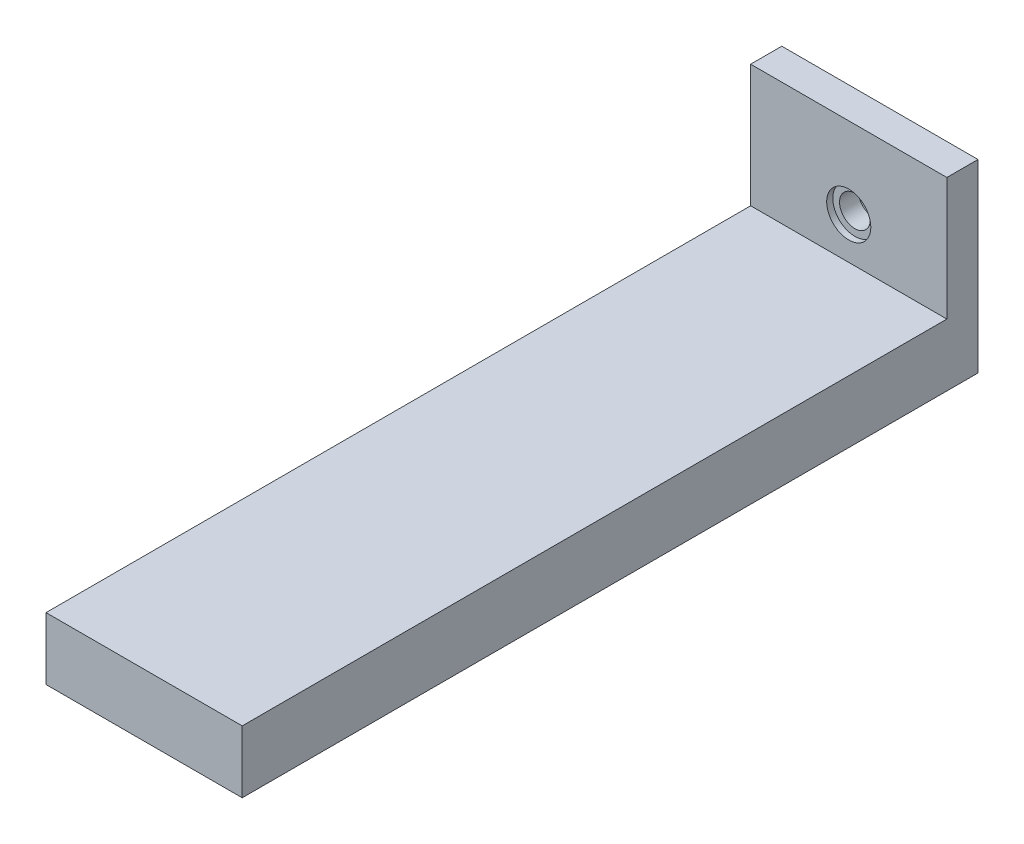
ISO-10303-21;
HEADER;
FILE_DESCRIPTION(('STEP AP214'),'2;1');
FILE_NAME('part.step','',(''),(''),'','','');
FILE_SCHEMA(('AUTOMOTIVE_DESIGN { 1 0 10303 214 1 1 1 1 }'));
ENDSEC;
DATA;
#1=APPLICATION_CONTEXT('core data for automotive mechanical design processes');
#2=APPLICATION_PROTOCOL_DEFINITION('international standard','automotive_design',2000,#1);
#3=PRODUCT_CONTEXT('',#1,'mechanical');
#4=PRODUCT('Part','Part','',(#3));
#5=PRODUCT_RELATED_PRODUCT_CATEGORY('part','',(#4));
#6=PRODUCT_DEFINITION_FORMATION('','',#4);
#7=PRODUCT_DEFINITION_CONTEXT('part definition',#1,'design');
#8=PRODUCT_DEFINITION('design','',#6,#7);
#9=PRODUCT_DEFINITION_SHAPE('','',#8);
#10=(LENGTH_UNIT() NAMED_UNIT(*) SI_UNIT(.MILLI.,.METRE.));
#11=(NAMED_UNIT(*) PLANE_ANGLE_UNIT() SI_UNIT($,.RADIAN.));
#12=(NAMED_UNIT(*) SI_UNIT($,.STERADIAN.) SOLID_ANGLE_UNIT());
#13=UNCERTAINTY_MEASURE_WITH_UNIT(LENGTH_MEASURE(1.E-05),#10,'distance_accuracy_value','');
#14=(GEOMETRIC_REPRESENTATION_CONTEXT(3) GLOBAL_UNCERTAINTY_ASSIGNED_CONTEXT((#13)) GLOBAL_UNIT_ASSIGNED_CONTEXT((#10,
#11,#12)) REPRESENTATION_CONTEXT('',''));
#15=CARTESIAN_POINT('',(0.,0.,0.));
#16=DIRECTION('',(0.,0.,1.));
#17=DIRECTION('',(1.,0.,0.));
#18=AXIS2_PLACEMENT_3D('',#15,#16,#17);
#19=CARTESIAN_POINT('',(0.,59.2348592439388,-374.6));
#20=DIRECTION('',(0.,0.,1.));
#21=DIRECTION('',(1.,0.,0.));
#22=AXIS2_PLACEMENT_3D('',#19,#20,#21);
#23=CYLINDRICAL_SURFACE('',#22,12.5);
#24=CARTESIAN_POINT('',(0.,59.2348592439388,-279.6));
#25=DIRECTION('',(0.,0.,1.));
#26=DIRECTION('',(1.,0.,0.));
#27=AXIS2_PLACEMENT_3D('',#24,#25,#26);
#28=CIRCLE('',#27,12.5);
#29=CARTESIAN_POINT('',(12.5,59.2348592439388,-279.6));
#30=VERTEX_POINT('',#29);
#31=EDGE_CURVE('E138',#30,#30,#28,.F.);
#32=ORIENTED_EDGE('',*,*,#31,.F.);
#33=EDGE_LOOP('',(#32));
#34=FACE_BOUND('',#33,.T.);
#35=CARTESIAN_POINT('',(0.,59.2348592439388,-295.));
#36=DIRECTION('',(0.,0.,-1.));
#37=DIRECTION('',(-1.,0.,0.));
#38=AXIS2_PLACEMENT_3D('',#35,#36,#37);
#39=CIRCLE('',#38,12.5);
#40=CARTESIAN_POINT('',(-12.5,59.2348592439388,-295.));
#41=VERTEX_POINT('',#40);
#42=EDGE_CURVE('E40',#41,#41,#39,.F.);
#43=ORIENTED_EDGE('',*,*,#42,.F.);
#44=EDGE_LOOP('',(#43));
#45=FACE_BOUND('',#44,.T.);
#46=ADVANCED_FACE('F36',(#34,#45),#23,.F.);
#47=CARTESIAN_POINT('',(80.,25.4,300.));
#48=DIRECTION('',(0.,-1.,0.));
#49=DIRECTION('',(1.,0.,0.));
#50=AXIS2_PLACEMENT_3D('',#47,#48,#49);
#51=PLANE('',#50);
#52=DIRECTION('',(1.,0.,0.));
#53=VECTOR('',#52,1.);
#54=CARTESIAN_POINT('',(-80.,25.4,-274.6));
#55=LINE('',#54,#53);
#56=CARTESIAN_POINT('',(-80.,25.4,-274.6));
#57=VERTEX_POINT('',#56);
#58=CARTESIAN_POINT('',(80.,25.4,-274.6));
#59=VERTEX_POINT('',#58);
#60=EDGE_CURVE('E53',#57,#59,#55,.T.);
#61=ORIENTED_EDGE('',*,*,#60,.F.);
#62=DIRECTION('',(0.,0.,-1.));
#63=VECTOR('',#62,1.);
#64=CARTESIAN_POINT('',(-80.,25.4,300.));
#65=LINE('',#64,#63);
#66=CARTESIAN_POINT('',(-80.,25.4,300.));
#67=VERTEX_POINT('',#66);
#68=EDGE_CURVE('E119',#67,#57,#65,.T.);
#69=ORIENTED_EDGE('',*,*,#68,.F.);
#70=DIRECTION('',(-1.,0.,0.));
#71=VECTOR('',#70,1.);
#72=CARTESIAN_POINT('',(80.,25.4,300.));
#73=LINE('',#72,#71);
#74=CARTESIAN_POINT('',(80.,25.4,300.));
#75=VERTEX_POINT('',#74);
#76=EDGE_CURVE('E62',#75,#67,#73,.T.);
#77=ORIENTED_EDGE('',*,*,#76,.F.);
#78=DIRECTION('',(0.,0.,-1.));
#79=VECTOR('',#78,1.);
#80=CARTESIAN_POINT('',(80.,25.4,300.));
#81=LINE('',#80,#79);
#82=EDGE_CURVE('E136',#75,#59,#81,.T.);
#83=ORIENTED_EDGE('',*,*,#82,.T.);
#84=EDGE_LOOP('',(#61,#69,#77,#83));
#85=FACE_BOUND('',#84,.T.);
#86=ADVANCED_FACE('F169',(#85),#51,.F.);
#87=CARTESIAN_POINT('',(-80.,-25.4,300.));
#88=DIRECTION('',(1.,0.,0.));
#89=DIRECTION('',(0.,0.,-1.));
#90=AXIS2_PLACEMENT_3D('',#87,#88,#89);
#91=PLANE('',#90);
#92=DIRECTION('',(0.,-1.,0.));
#93=VECTOR('',#92,1.);
#94=CARTESIAN_POINT('',(-80.,-25.4,-300.));
#95=LINE('',#94,#93);
#96=CARTESIAN_POINT('',(-80.,125.4,-300.));
#97=VERTEX_POINT('',#96);
#98=CARTESIAN_POINT('',(-80.,-25.4,-300.));
#99=VERTEX_POINT('',#98);
#100=EDGE_CURVE('E120',#97,#99,#95,.T.);
#101=ORIENTED_EDGE('',*,*,#100,.T.);
#102=DIRECTION('',(0.,0.,-1.));
#103=VECTOR('',#102,1.);
#104=CARTESIAN_POINT('',(-80.,-25.4,300.));
#105=LINE('',#104,#103);
#106=CARTESIAN_POINT('',(-80.,-25.4,300.));
#107=VERTEX_POINT('',#106);
#108=EDGE_CURVE('E11',#107,#99,#105,.T.);
#109=ORIENTED_EDGE('',*,*,#108,.F.);
#110=DIRECTION('',(0.,-1.,0.));
#111=VECTOR('',#110,1.);
#112=CARTESIAN_POINT('',(-80.,-25.4,300.));
#113=LINE('',#112,#111);
#114=EDGE_CURVE('E126',#67,#107,#113,.T.);
#115=ORIENTED_EDGE('',*,*,#114,.F.);
#116=ORIENTED_EDGE('',*,*,#68,.T.);
#117=DIRECTION('',(0.,-1.,0.));
#118=VECTOR('',#117,1.);
#119=CARTESIAN_POINT('',(-80.,125.4,-274.6));
#120=LINE('',#119,#118);
#121=CARTESIAN_POINT('',(-80.,125.4,-274.6));
#122=VERTEX_POINT('',#121);
#123=EDGE_CURVE('E101',#122,#57,#120,.T.);
#124=ORIENTED_EDGE('',*,*,#123,.F.);
#125=DIRECTION('',(0.,0.,1.));
#126=VECTOR('',#125,1.);
#127=CARTESIAN_POINT('',(-80.,125.4,-300.));
#128=LINE('',#127,#126);
#129=EDGE_CURVE('E108',#97,#122,#128,.T.);
#130=ORIENTED_EDGE('',*,*,#129,.F.);
#131=EDGE_LOOP('',(#101,#109,#115,#116,#124,#130));
#132=FACE_BOUND('',#131,.T.);
#133=ADVANCED_FACE('F38',(#132),#91,.F.);
#134=CARTESIAN_POINT('',(80.,-25.4,300.));
#135=DIRECTION('',(0.,1.,0.));
#136=DIRECTION('',(-1.,0.,0.));
#137=AXIS2_PLACEMENT_3D('',#134,#135,#136);
#138=PLANE('',#137);
#139=DIRECTION('',(1.,0.,0.));
#140=VECTOR('',#139,1.);
#141=CARTESIAN_POINT('',(80.,-25.4,-300.));
#142=LINE('',#141,#140);
#143=CARTESIAN_POINT('',(80.,-25.4,-300.));
#144=VERTEX_POINT('',#143);
#145=EDGE_CURVE('E75',#99,#144,#142,.T.);
#146=ORIENTED_EDGE('',*,*,#145,.T.);
#147=DIRECTION('',(0.,0.,-1.));
#148=VECTOR('',#147,1.);
#149=CARTESIAN_POINT('',(80.,-25.4,300.));
#150=LINE('',#149,#148);
#151=CARTESIAN_POINT('',(80.,-25.4,300.));
#152=VERTEX_POINT('',#151);
#153=EDGE_CURVE('E45',#152,#144,#150,.T.);
#154=ORIENTED_EDGE('',*,*,#153,.F.);
#155=DIRECTION('',(1.,0.,0.));
#156=VECTOR('',#155,1.);
#157=CARTESIAN_POINT('',(80.,-25.4,300.));
#158=LINE('',#157,#156);
#159=EDGE_CURVE('E80',#107,#152,#158,.T.);
#160=ORIENTED_EDGE('',*,*,#159,.F.);
#161=ORIENTED_EDGE('',*,*,#108,.T.);
#162=EDGE_LOOP('',(#146,#154,#160,#161));
#163=FACE_BOUND('',#162,.T.);
#164=ADVANCED_FACE('F160',(#163),#138,.F.);
#165=CARTESIAN_POINT('',(80.,-25.4,300.));
#166=DIRECTION('',(-1.,0.,0.));
#167=DIRECTION('',(0.,0.,1.));
#168=AXIS2_PLACEMENT_3D('',#165,#166,#167);
#169=PLANE('',#168);
#170=DIRECTION('',(0.,1.,0.));
#171=VECTOR('',#170,1.);
#172=CARTESIAN_POINT('',(80.,-25.4,-300.));
#173=LINE('',#172,#171);
#174=CARTESIAN_POINT('',(80.,125.4,-300.));
#175=VERTEX_POINT('',#174);
#176=EDGE_CURVE('E128',#144,#175,#173,.T.);
#177=ORIENTED_EDGE('',*,*,#176,.T.);
#178=DIRECTION('',(0.,0.,-1.));
#179=VECTOR('',#178,1.);
#180=CARTESIAN_POINT('',(80.,125.4,-300.));
#181=LINE('',#180,#179);
#182=CARTESIAN_POINT('',(80.,125.4,-274.6));
#183=VERTEX_POINT('',#182);
#184=EDGE_CURVE('E107',#183,#175,#181,.T.);
#185=ORIENTED_EDGE('',*,*,#184,.F.);
#186=DIRECTION('',(0.,-1.,0.));
#187=VECTOR('',#186,1.);
#188=CARTESIAN_POINT('',(80.,125.4,-274.6));
#189=LINE('',#188,#187);
#190=EDGE_CURVE('E103',#183,#59,#189,.T.);
#191=ORIENTED_EDGE('',*,*,#190,.T.);
#192=ORIENTED_EDGE('',*,*,#82,.F.);
#193=DIRECTION('',(0.,1.,0.));
#194=VECTOR('',#193,1.);
#195=CARTESIAN_POINT('',(80.,-25.4,300.));
#196=LINE('',#195,#194);
#197=EDGE_CURVE('E130',#152,#75,#196,.T.);
#198=ORIENTED_EDGE('',*,*,#197,.F.);
#199=ORIENTED_EDGE('',*,*,#153,.T.);
#200=EDGE_LOOP('',(#177,#185,#191,#192,#198,#199));
#201=FACE_BOUND('',#200,.T.);
#202=ADVANCED_FACE('F162',(#201),#169,.F.);
#203=CARTESIAN_POINT('',(0.,0.,300.));
#204=DIRECTION('',(0.,0.,1.));
#205=DIRECTION('',(1.,0.,0.));
#206=AXIS2_PLACEMENT_3D('',#203,#204,#205);
#207=PLANE('',#206);
#208=ORIENTED_EDGE('',*,*,#114,.T.);
#209=ORIENTED_EDGE('',*,*,#159,.T.);
#210=ORIENTED_EDGE('',*,*,#197,.T.);
#211=ORIENTED_EDGE('',*,*,#76,.T.);
#212=EDGE_LOOP('',(#208,#209,#210,#211));
#213=FACE_BOUND('',#212,.T.);
#214=ADVANCED_FACE('F167',(#213),#207,.T.);
#215=CARTESIAN_POINT('',(0.,0.,-300.));
#216=DIRECTION('',(0.,0.,1.));
#217=DIRECTION('',(1.,0.,0.));
#218=AXIS2_PLACEMENT_3D('',#215,#216,#217);
#219=PLANE('',#218);
#220=CARTESIAN_POINT('',(0.,59.2348592439388,-300.));
#221=DIRECTION('',(0.,0.,-1.));
#222=DIRECTION('',(-1.,0.,0.));
#223=AXIS2_PLACEMENT_3D('',#220,#221,#222);
#224=CIRCLE('',#223,18.);
#225=CARTESIAN_POINT('',(-18.,59.2348592439388,-300.));
#226=VERTEX_POINT('',#225);
#227=EDGE_CURVE('E151',#226,#226,#224,.T.);
#228=ORIENTED_EDGE('',*,*,#227,.F.);
#229=EDGE_LOOP('',(#228));
#230=FACE_BOUND('',#229,.T.);
#231=ORIENTED_EDGE('',*,*,#100,.F.);
#232=DIRECTION('',(-1.,0.,0.));
#233=VECTOR('',#232,1.);
#234=CARTESIAN_POINT('',(-80.,125.4,-300.));
#235=LINE('',#234,#233);
#236=EDGE_CURVE('E114',#175,#97,#235,.T.);
#237=ORIENTED_EDGE('',*,*,#236,.F.);
#238=ORIENTED_EDGE('',*,*,#176,.F.);
#239=ORIENTED_EDGE('',*,*,#145,.F.);
#240=EDGE_LOOP('',(#231,#237,#238,#239));
#241=FACE_BOUND('',#240,.T.);
#242=ADVANCED_FACE('F158',(#230,#241),#219,.F.);
#243=CARTESIAN_POINT('',(-80.,125.4,-274.6));
#244=DIRECTION('',(0.,0.,-1.));
#245=DIRECTION('',(-1.,0.,0.));
#246=AXIS2_PLACEMENT_3D('',#243,#244,#245);
#247=PLANE('',#246);
#248=CARTESIAN_POINT('',(0.,59.2348592439388,-274.6));
#249=DIRECTION('',(0.,0.,1.));
#250=DIRECTION('',(1.,0.,0.));
#251=AXIS2_PLACEMENT_3D('',#248,#249,#250);
#252=CIRCLE('',#251,18.);
#253=CARTESIAN_POINT('',(18.,59.2348592439388,-274.6));
#254=VERTEX_POINT('',#253);
#255=EDGE_CURVE('E144',#254,#254,#252,.T.);
#256=ORIENTED_EDGE('',*,*,#255,.F.);
#257=EDGE_LOOP('',(#256));
#258=FACE_BOUND('',#257,.T.);
#259=ORIENTED_EDGE('',*,*,#60,.T.);
#260=ORIENTED_EDGE('',*,*,#190,.F.);
#261=DIRECTION('',(1.,0.,0.));
#262=VECTOR('',#261,1.);
#263=CARTESIAN_POINT('',(-80.,125.4,-274.6));
#264=LINE('',#263,#262);
#265=EDGE_CURVE('E97',#122,#183,#264,.T.);
#266=ORIENTED_EDGE('',*,*,#265,.F.);
#267=ORIENTED_EDGE('',*,*,#123,.T.);
#268=EDGE_LOOP('',(#259,#260,#266,#267));
#269=FACE_BOUND('',#268,.T.);
#270=ADVANCED_FACE('F99',(#258,#269),#247,.F.);
#271=CARTESIAN_POINT('',(0.,125.4,0.));
#272=DIRECTION('',(0.,1.,0.));
#273=DIRECTION('',(-1.,0.,0.));
#274=AXIS2_PLACEMENT_3D('',#271,#272,#273);
#275=PLANE('',#274);
#276=ORIENTED_EDGE('',*,*,#129,.T.);
#277=ORIENTED_EDGE('',*,*,#265,.T.);
#278=ORIENTED_EDGE('',*,*,#184,.T.);
#279=ORIENTED_EDGE('',*,*,#236,.T.);
#280=EDGE_LOOP('',(#276,#277,#278,#279));
#281=FACE_BOUND('',#280,.T.);
#282=ADVANCED_FACE('F112',(#281),#275,.T.);
#283=CARTESIAN_POINT('',(0.,59.2348592439388,-279.6));
#284=DIRECTION('',(0.,0.,1.));
#285=DIRECTION('',(1.,0.,0.));
#286=AXIS2_PLACEMENT_3D('',#283,#284,#285);
#287=PLANE('',#286);
#288=CARTESIAN_POINT('',(0.,59.2348592439388,-279.6));
#289=DIRECTION('',(0.,0.,1.));
#290=DIRECTION('',(1.,0.,0.));
#291=AXIS2_PLACEMENT_3D('',#288,#289,#290);
#292=CIRCLE('',#291,18.);
#293=CARTESIAN_POINT('',(18.,59.2348592439388,-279.6));
#294=VERTEX_POINT('',#293);
#295=EDGE_CURVE('E140',#294,#294,#292,.T.);
#296=ORIENTED_EDGE('',*,*,#295,.T.);
#297=EDGE_LOOP('',(#296));
#298=FACE_BOUND('',#297,.T.);
#299=ORIENTED_EDGE('',*,*,#31,.T.);
#300=EDGE_LOOP('',(#299));
#301=FACE_BOUND('',#300,.T.);
#302=ADVANCED_FACE('F184',(#298,#301),#287,.T.);
#303=CARTESIAN_POINT('',(0.,59.2348592439388,-279.6));
#304=DIRECTION('',(0.,0.,1.));
#305=DIRECTION('',(1.,0.,0.));
#306=AXIS2_PLACEMENT_3D('',#303,#304,#305);
#307=CYLINDRICAL_SURFACE('',#306,18.);
#308=ORIENTED_EDGE('',*,*,#295,.F.);
#309=EDGE_LOOP('',(#308));
#310=FACE_BOUND('',#309,.T.);
#311=ORIENTED_EDGE('',*,*,#255,.T.);
#312=EDGE_LOOP('',(#311));
#313=FACE_BOUND('',#312,.T.);
#314=ADVANCED_FACE('F180',(#310,#313),#307,.F.);
#315=CARTESIAN_POINT('',(0.,59.2348592439388,-295.));
#316=DIRECTION('',(0.,0.,-1.));
#317=DIRECTION('',(-1.,0.,0.));
#318=AXIS2_PLACEMENT_3D('',#315,#316,#317);
#319=PLANE('',#318);
#320=CARTESIAN_POINT('',(0.,59.2348592439388,-295.));
#321=DIRECTION('',(0.,0.,-1.));
#322=DIRECTION('',(-1.,0.,0.));
#323=AXIS2_PLACEMENT_3D('',#320,#321,#322);
#324=CIRCLE('',#323,18.);
#325=CARTESIAN_POINT('',(-18.,59.2348592439388,-295.));
#326=VERTEX_POINT('',#325);
#327=EDGE_CURVE('E197',#326,#326,#324,.T.);
#328=ORIENTED_EDGE('',*,*,#327,.T.);
#329=EDGE_LOOP('',(#328));
#330=FACE_BOUND('',#329,.T.);
#331=ORIENTED_EDGE('',*,*,#42,.T.);
#332=EDGE_LOOP('',(#331));
#333=FACE_BOUND('',#332,.T.);
#334=ADVANCED_FACE('F204',(#330,#333),#319,.T.);
#335=CARTESIAN_POINT('',(0.,59.2348592439388,-295.));
#336=DIRECTION('',(0.,0.,-1.));
#337=DIRECTION('',(-1.,0.,0.));
#338=AXIS2_PLACEMENT_3D('',#335,#336,#337);
#339=CYLINDRICAL_SURFACE('',#338,18.);
#340=ORIENTED_EDGE('',*,*,#327,.F.);
#341=EDGE_LOOP('',(#340));
#342=FACE_BOUND('',#341,.T.);
#343=ORIENTED_EDGE('',*,*,#227,.T.);
#344=EDGE_LOOP('',(#343));
#345=FACE_BOUND('',#344,.T.);
#346=ADVANCED_FACE('F206',(#342,#345),#339,.F.);
#347=CLOSED_SHELL('',(#46,#86,#133,#164,#202,#214,#242,#270,#282,#302,#314,#334,#346));
#348=MANIFOLD_SOLID_BREP('B2',#347);
#349=ADVANCED_BREP_SHAPE_REPRESENTATION('',(#18,#348),#14);
#350=SHAPE_DEFINITION_REPRESENTATION(#9,#349);
ENDSEC;
END-ISO-10303-21;
